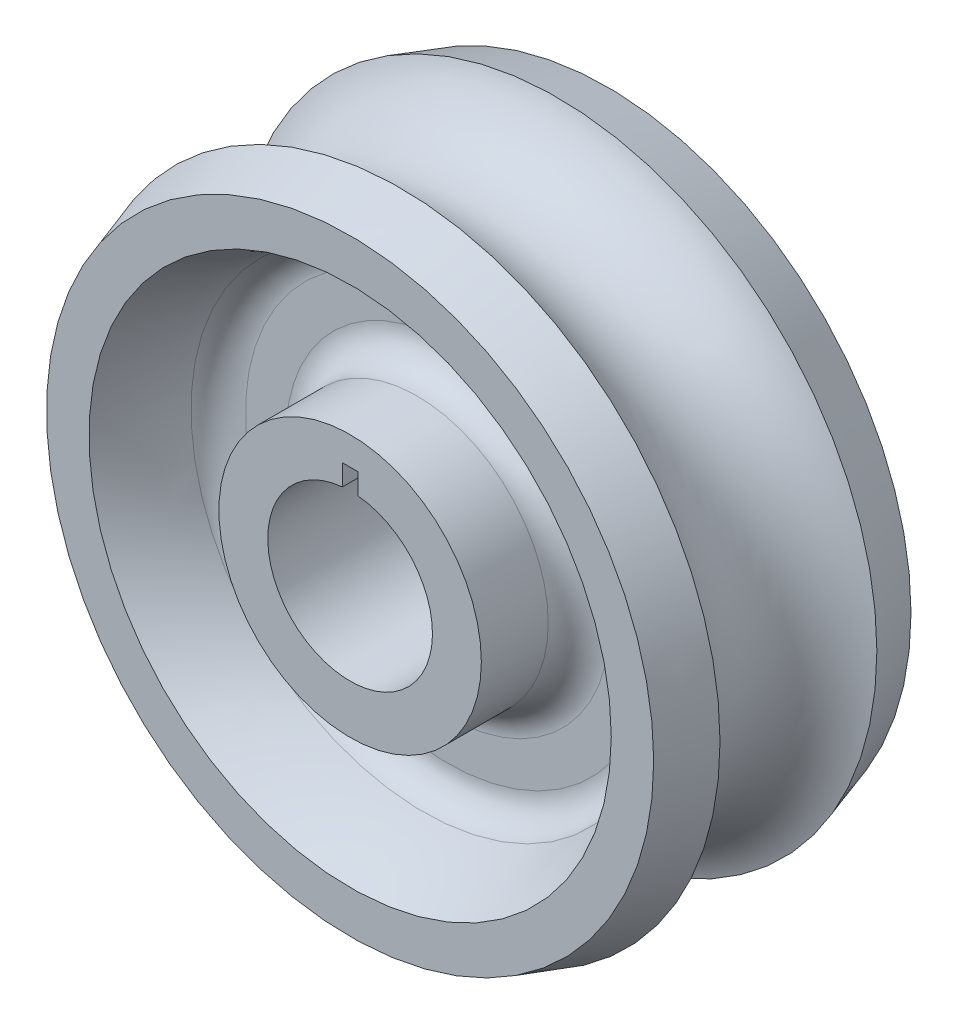
ISO-10303-21;
HEADER;
FILE_DESCRIPTION(('STEP AP214'),'2;1');
FILE_NAME('part.step','',(''),(''),'','','');
FILE_SCHEMA(('AUTOMOTIVE_DESIGN { 1 0 10303 214 1 1 1 1 }'));
ENDSEC;
DATA;
#1=APPLICATION_CONTEXT('core data for automotive mechanical design processes');
#2=APPLICATION_PROTOCOL_DEFINITION('international standard','automotive_design',2000,#1);
#3=PRODUCT_CONTEXT('',#1,'mechanical');
#4=PRODUCT('Part','Part','',(#3));
#5=PRODUCT_RELATED_PRODUCT_CATEGORY('part','',(#4));
#6=PRODUCT_DEFINITION_FORMATION('','',#4);
#7=PRODUCT_DEFINITION_CONTEXT('part definition',#1,'design');
#8=PRODUCT_DEFINITION('design','',#6,#7);
#9=PRODUCT_DEFINITION_SHAPE('','',#8);
#10=(LENGTH_UNIT() NAMED_UNIT(*) SI_UNIT(.MILLI.,.METRE.));
#11=(NAMED_UNIT(*) PLANE_ANGLE_UNIT() SI_UNIT($,.RADIAN.));
#12=(NAMED_UNIT(*) SI_UNIT($,.STERADIAN.) SOLID_ANGLE_UNIT());
#13=UNCERTAINTY_MEASURE_WITH_UNIT(LENGTH_MEASURE(1.E-05),#10,'distance_accuracy_value','');
#14=(GEOMETRIC_REPRESENTATION_CONTEXT(3) GLOBAL_UNCERTAINTY_ASSIGNED_CONTEXT((#13)) GLOBAL_UNIT_ASSIGNED_CONTEXT((#10,
#11,#12)) REPRESENTATION_CONTEXT('',''));
#15=CARTESIAN_POINT('',(0.,0.,0.));
#16=DIRECTION('',(0.,0.,1.));
#17=DIRECTION('',(1.,0.,0.));
#18=AXIS2_PLACEMENT_3D('',#15,#16,#17);
#19=CARTESIAN_POINT('',(0.,8.,-12.5));
#20=DIRECTION('',(0.,0.,1.));
#21=DIRECTION('',(1.,0.,0.));
#22=AXIS2_PLACEMENT_3D('',#19,#20,#21);
#23=PLANE('',#22);
#24=CARTESIAN_POINT('',(0.,0.,-12.5));
#25=DIRECTION('',(0.,0.,1.));
#26=DIRECTION('',(1.,0.,0.));
#27=AXIS2_PLACEMENT_3D('',#24,#25,#26);
#28=CIRCLE('',#27,12.75);
#29=CARTESIAN_POINT('',(12.75,0.,-12.5));
#30=VERTEX_POINT('',#29);
#31=EDGE_CURVE('E111',#30,#30,#28,.T.);
#32=ORIENTED_EDGE('',*,*,#31,.F.);
#33=EDGE_LOOP('',(#32));
#34=FACE_BOUND('',#33,.T.);
#35=DIRECTION('',(0.,1.,0.));
#36=VECTOR('',#35,1.);
#37=CARTESIAN_POINT('',(-0.75,7.964766161037,-12.5));
#38=LINE('',#37,#36);
#39=CARTESIAN_POINT('',(-0.75,7.964766161037,-12.5));
#40=VERTEX_POINT('',#39);
#41=CARTESIAN_POINT('',(-0.75,10.,-12.5));
#42=VERTEX_POINT('',#41);
#43=EDGE_CURVE('E84',#40,#42,#38,.T.);
#44=ORIENTED_EDGE('',*,*,#43,.F.);
#45=CARTESIAN_POINT('',(0.,0.,-12.5));
#46=DIRECTION('',(0.,0.,1.));
#47=DIRECTION('',(1.,0.,0.));
#48=AXIS2_PLACEMENT_3D('',#45,#46,#47);
#49=CIRCLE('',#48,8.);
#50=CARTESIAN_POINT('',(0.75,7.964766161037,-12.5));
#51=VERTEX_POINT('',#50);
#52=EDGE_CURVE('E11',#40,#51,#49,.T.);
#53=ORIENTED_EDGE('',*,*,#52,.T.);
#54=DIRECTION('',(0.,1.,0.));
#55=VECTOR('',#54,1.);
#56=CARTESIAN_POINT('',(0.75,7.964766161037,-12.5));
#57=LINE('',#56,#55);
#58=CARTESIAN_POINT('',(0.75,10.,-12.5));
#59=VERTEX_POINT('',#58);
#60=EDGE_CURVE('E60',#51,#59,#57,.T.);
#61=ORIENTED_EDGE('',*,*,#60,.T.);
#62=DIRECTION('',(1.,0.,0.));
#63=VECTOR('',#62,1.);
#64=CARTESIAN_POINT('',(-0.75,10.,-12.5));
#65=LINE('',#64,#63);
#66=EDGE_CURVE('E91',#42,#59,#65,.T.);
#67=ORIENTED_EDGE('',*,*,#66,.F.);
#68=EDGE_LOOP('',(#44,#53,#61,#67));
#69=FACE_BOUND('',#68,.T.);
#70=ADVANCED_FACE('F39',(#34,#69),#23,.F.);
#71=CARTESIAN_POINT('',(0.,0.,0.));
#72=DIRECTION('',(0.,0.,1.));
#73=DIRECTION('',(1.,0.,0.));
#74=AXIS2_PLACEMENT_3D('',#71,#72,#73);
#75=CYLINDRICAL_SURFACE('',#74,8.);
#76=DIRECTION('',(0.,0.,1.));
#77=VECTOR('',#76,1.);
#78=CARTESIAN_POINT('',(-0.75,7.964766161037,-12.5));
#79=LINE('',#78,#77);
#80=CARTESIAN_POINT('',(-0.75,7.964766161037,12.5));
#81=VERTEX_POINT('',#80);
#82=EDGE_CURVE('E82',#40,#81,#79,.T.);
#83=ORIENTED_EDGE('',*,*,#82,.T.);
#84=CARTESIAN_POINT('',(0.,0.,12.5));
#85=DIRECTION('',(0.,0.,1.));
#86=DIRECTION('',(1.,0.,0.));
#87=AXIS2_PLACEMENT_3D('',#84,#85,#86);
#88=CIRCLE('',#87,8.);
#89=CARTESIAN_POINT('',(0.75,7.964766161037,12.5));
#90=VERTEX_POINT('',#89);
#91=EDGE_CURVE('E47',#81,#90,#88,.T.);
#92=ORIENTED_EDGE('',*,*,#91,.T.);
#93=DIRECTION('',(0.,0.,1.));
#94=VECTOR('',#93,1.);
#95=CARTESIAN_POINT('',(0.75,7.964766161037,-12.5));
#96=LINE('',#95,#94);
#97=EDGE_CURVE('E54',#51,#90,#96,.T.);
#98=ORIENTED_EDGE('',*,*,#97,.F.);
#99=ORIENTED_EDGE('',*,*,#52,.F.);
#100=EDGE_LOOP('',(#83,#92,#98,#99));
#101=FACE_BOUND('',#100,.T.);
#102=ADVANCED_FACE('F163',(#101),#75,.F.);
#103=CARTESIAN_POINT('',(0.,8.,12.5));
#104=DIRECTION('',(0.,0.,1.));
#105=DIRECTION('',(1.,0.,0.));
#106=AXIS2_PLACEMENT_3D('',#103,#104,#105);
#107=PLANE('',#106);
#108=CARTESIAN_POINT('',(0.,0.,12.5));
#109=DIRECTION('',(0.,0.,1.));
#110=DIRECTION('',(1.,0.,0.));
#111=AXIS2_PLACEMENT_3D('',#108,#109,#110);
#112=CIRCLE('',#111,12.75);
#113=CARTESIAN_POINT('',(12.75,0.,12.5));
#114=VERTEX_POINT('',#113);
#115=EDGE_CURVE('E156',#114,#114,#112,.T.);
#116=ORIENTED_EDGE('',*,*,#115,.T.);
#117=EDGE_LOOP('',(#116));
#118=FACE_BOUND('',#117,.T.);
#119=ORIENTED_EDGE('',*,*,#91,.F.);
#120=DIRECTION('',(0.,1.,0.));
#121=VECTOR('',#120,1.);
#122=CARTESIAN_POINT('',(-0.75,7.964766161037,12.5));
#123=LINE('',#122,#121);
#124=CARTESIAN_POINT('',(-0.75,10.,12.5));
#125=VERTEX_POINT('',#124);
#126=EDGE_CURVE('E103',#81,#125,#123,.T.);
#127=ORIENTED_EDGE('',*,*,#126,.T.);
#128=DIRECTION('',(1.,0.,0.));
#129=VECTOR('',#128,1.);
#130=CARTESIAN_POINT('',(-0.75,10.,12.5));
#131=LINE('',#130,#129);
#132=CARTESIAN_POINT('',(0.75,10.,12.5));
#133=VERTEX_POINT('',#132);
#134=EDGE_CURVE('E96',#125,#133,#131,.T.);
#135=ORIENTED_EDGE('',*,*,#134,.T.);
#136=DIRECTION('',(0.,1.,0.));
#137=VECTOR('',#136,1.);
#138=CARTESIAN_POINT('',(0.75,7.964766161037,12.5));
#139=LINE('',#138,#137);
#140=EDGE_CURVE('E92',#90,#133,#139,.T.);
#141=ORIENTED_EDGE('',*,*,#140,.F.);
#142=EDGE_LOOP('',(#119,#127,#135,#141));
#143=FACE_BOUND('',#142,.T.);
#144=ADVANCED_FACE('F165',(#118,#143),#107,.T.);
#145=CARTESIAN_POINT('',(0.,0.,0.));
#146=DIRECTION('',(0.,0.,1.));
#147=DIRECTION('',(1.,0.,0.));
#148=AXIS2_PLACEMENT_3D('',#145,#146,#147);
#149=CYLINDRICAL_SURFACE('',#148,12.75);
#150=CARTESIAN_POINT('',(0.,0.,6.));
#151=DIRECTION('',(0.,0.,1.));
#152=DIRECTION('',(1.,0.,0.));
#153=AXIS2_PLACEMENT_3D('',#150,#151,#152);
#154=CIRCLE('',#153,12.75);
#155=CARTESIAN_POINT('',(12.75,0.,6.));
#156=VERTEX_POINT('',#155);
#157=EDGE_CURVE('E153',#156,#156,#154,.T.);
#158=ORIENTED_EDGE('',*,*,#157,.T.);
#159=EDGE_LOOP('',(#158));
#160=FACE_BOUND('',#159,.T.);
#161=ORIENTED_EDGE('',*,*,#115,.F.);
#162=EDGE_LOOP('',(#161));
#163=FACE_BOUND('',#162,.T.);
#164=ADVANCED_FACE('F241',(#160,#163),#149,.T.);
#165=CARTESIAN_POINT('',(0.,0.,6.));
#166=DIRECTION('',(0.,0.,1.));
#167=DIRECTION('',(1.,0.,0.));
#168=AXIS2_PLACEMENT_3D('',#165,#166,#167);
#169=TOROIDAL_SURFACE('',#168,15.75,3.);
#170=CARTESIAN_POINT('',(0.,0.,3.));
#171=DIRECTION('',(0.,0.,1.));
#172=DIRECTION('',(1.,0.,0.));
#173=AXIS2_PLACEMENT_3D('',#170,#171,#172);
#174=CIRCLE('',#173,15.75);
#175=CARTESIAN_POINT('',(15.75,0.,3.));
#176=VERTEX_POINT('',#175);
#177=EDGE_CURVE('E150',#176,#176,#174,.T.);
#178=ORIENTED_EDGE('',*,*,#177,.T.);
#179=EDGE_LOOP('',(#178));
#180=FACE_BOUND('',#179,.T.);
#181=ORIENTED_EDGE('',*,*,#157,.F.);
#182=EDGE_LOOP('',(#181));
#183=FACE_BOUND('',#182,.T.);
#184=ADVANCED_FACE('F237',(#180,#183),#169,.F.);
#185=CARTESIAN_POINT('',(0.,15.75,3.));
#186=DIRECTION('',(0.,0.,1.));
#187=DIRECTION('',(1.,0.,0.));
#188=AXIS2_PLACEMENT_3D('',#185,#186,#187);
#189=PLANE('',#188);
#190=CARTESIAN_POINT('',(0.,0.,3.));
#191=DIRECTION('',(0.,0.,1.));
#192=DIRECTION('',(1.,0.,0.));
#193=AXIS2_PLACEMENT_3D('',#190,#191,#192);
#194=CIRCLE('',#193,19.6760464322563);
#195=CARTESIAN_POINT('',(19.6760464322563,0.,3.));
#196=VERTEX_POINT('',#195);
#197=EDGE_CURVE('E147',#196,#196,#194,.T.);
#198=ORIENTED_EDGE('',*,*,#197,.T.);
#199=EDGE_LOOP('',(#198));
#200=FACE_BOUND('',#199,.T.);
#201=ORIENTED_EDGE('',*,*,#177,.F.);
#202=EDGE_LOOP('',(#201));
#203=FACE_BOUND('',#202,.T.);
#204=ADVANCED_FACE('F233',(#200,#203),#189,.T.);
#205=CARTESIAN_POINT('',(0.,0.,6.));
#206=DIRECTION('',(0.,0.,1.));
#207=DIRECTION('',(1.,0.,0.));
#208=AXIS2_PLACEMENT_3D('',#205,#206,#207);
#209=TOROIDAL_SURFACE('',#208,19.6760464322563,3.);
#210=CARTESIAN_POINT('',(0.,0.,5.35714285714286));
#211=DIRECTION('',(0.,0.,1.));
#212=DIRECTION('',(1.,0.,0.));
#213=AXIS2_PLACEMENT_3D('',#210,#211,#212);
#214=CIRCLE('',#213,22.6063595032229);
#215=CARTESIAN_POINT('',(22.6063595032229,0.,5.35714285714286));
#216=VERTEX_POINT('',#215);
#217=EDGE_CURVE('E144',#216,#216,#214,.T.);
#218=ORIENTED_EDGE('',*,*,#217,.T.);
#219=EDGE_LOOP('',(#218));
#220=FACE_BOUND('',#219,.T.);
#221=ORIENTED_EDGE('',*,*,#197,.F.);
#222=EDGE_LOOP('',(#221));
#223=FACE_BOUND('',#222,.T.);
#224=ADVANCED_FACE('F229',(#220,#223),#209,.F.);
#225=CARTESIAN_POINT('',(0.,0.,0.));
#226=DIRECTION('',(0.,0.,1.));
#227=DIRECTION('',(1.,0.,0.));
#228=AXIS2_PLACEMENT_3D('',#225,#226,#227);
#229=TOROIDAL_SURFACE('',#228,47.025635094611,25.);
#230=CARTESIAN_POINT('',(0.,0.,12.5));
#231=DIRECTION('',(0.,0.,1.));
#232=DIRECTION('',(1.,0.,0.));
#233=AXIS2_PLACEMENT_3D('',#230,#231,#232);
#234=CIRCLE('',#233,25.375);
#235=CARTESIAN_POINT('',(25.375,0.,12.5));
#236=VERTEX_POINT('',#235);
#237=EDGE_CURVE('E141',#236,#236,#234,.T.);
#238=ORIENTED_EDGE('',*,*,#237,.T.);
#239=EDGE_LOOP('',(#238));
#240=FACE_BOUND('',#239,.T.);
#241=ORIENTED_EDGE('',*,*,#217,.F.);
#242=EDGE_LOOP('',(#241));
#243=FACE_BOUND('',#242,.T.);
#244=ADVANCED_FACE('F225',(#240,#243),#229,.T.);
#245=CARTESIAN_POINT('',(0.,25.375,12.5));
#246=DIRECTION('',(0.,0.,1.));
#247=DIRECTION('',(1.,0.,0.));
#248=AXIS2_PLACEMENT_3D('',#245,#246,#247);
#249=PLANE('',#248);
#250=CARTESIAN_POINT('',(0.,0.,12.5));
#251=DIRECTION('',(0.,0.,1.));
#252=DIRECTION('',(1.,0.,0.));
#253=AXIS2_PLACEMENT_3D('',#250,#251,#252);
#254=CIRCLE('',#253,29.5);
#255=CARTESIAN_POINT('',(29.5,0.,12.5));
#256=VERTEX_POINT('',#255);
#257=EDGE_CURVE('E138',#256,#256,#254,.T.);
#258=ORIENTED_EDGE('',*,*,#257,.T.);
#259=EDGE_LOOP('',(#258));
#260=FACE_BOUND('',#259,.T.);
#261=ORIENTED_EDGE('',*,*,#237,.F.);
#262=EDGE_LOOP('',(#261));
#263=FACE_BOUND('',#262,.T.);
#264=ADVANCED_FACE('F221',(#260,#263),#249,.T.);
#265=CARTESIAN_POINT('',(0.,0.,12.5));
#266=DIRECTION('',(0.,0.,-1.));
#267=DIRECTION('',(-1.,0.,0.));
#268=AXIS2_PLACEMENT_3D('',#265,#266,#267);
#269=CONICAL_SURFACE('',#268,29.5,0.309702944542456);
#270=CARTESIAN_POINT('',(0.,0.,7.61939317759459));
#271=DIRECTION('',(0.,0.,1.));
#272=DIRECTION('',(1.,0.,0.));
#273=AXIS2_PLACEMENT_3D('',#270,#271,#272);
#274=CIRCLE('',#273,31.0617941831697);
#275=CARTESIAN_POINT('',(31.0617941831697,0.,7.61939317759459));
#276=VERTEX_POINT('',#275);
#277=EDGE_CURVE('E135',#276,#276,#274,.T.);
#278=ORIENTED_EDGE('',*,*,#277,.T.);
#279=EDGE_LOOP('',(#278));
#280=FACE_BOUND('',#279,.T.);
#281=ORIENTED_EDGE('',*,*,#257,.F.);
#282=EDGE_LOOP('',(#281));
#283=FACE_BOUND('',#282,.T.);
#284=ADVANCED_FACE('F217',(#280,#283),#269,.T.);
#285=CARTESIAN_POINT('',(0.,0.,0.));
#286=DIRECTION('',(0.,0.,1.));
#287=DIRECTION('',(1.,0.,0.));
#288=AXIS2_PLACEMENT_3D('',#285,#286,#287);
#289=TOROIDAL_SURFACE('',#288,33.5,8.);
#290=ORIENTED_EDGE('',*,*,#277,.F.);
#291=EDGE_LOOP('',(#290));
#292=FACE_BOUND('',#291,.T.);
#293=CARTESIAN_POINT('',(0.,0.,-7.61939317759459));
#294=DIRECTION('',(0.,0.,1.));
#295=DIRECTION('',(1.,0.,0.));
#296=AXIS2_PLACEMENT_3D('',#293,#294,#295);
#297=CIRCLE('',#296,31.0617941831697);
#298=CARTESIAN_POINT('',(31.0617941831697,0.,-7.61939317759459));
#299=VERTEX_POINT('',#298);
#300=EDGE_CURVE('E132',#299,#299,#297,.T.);
#301=ORIENTED_EDGE('',*,*,#300,.T.);
#302=EDGE_LOOP('',(#301));
#303=FACE_BOUND('',#302,.T.);
#304=ADVANCED_FACE('F213',(#292,#303),#289,.F.);
#305=CARTESIAN_POINT('',(0.,0.,-12.5));
#306=DIRECTION('',(0.,0.,1.));
#307=DIRECTION('',(1.,0.,0.));
#308=AXIS2_PLACEMENT_3D('',#305,#306,#307);
#309=CONICAL_SURFACE('',#308,29.5,0.309702944542457);
#310=ORIENTED_EDGE('',*,*,#300,.F.);
#311=EDGE_LOOP('',(#310));
#312=FACE_BOUND('',#311,.T.);
#313=CARTESIAN_POINT('',(0.,0.,-12.5));
#314=DIRECTION('',(0.,0.,1.));
#315=DIRECTION('',(1.,0.,0.));
#316=AXIS2_PLACEMENT_3D('',#313,#314,#315);
#317=CIRCLE('',#316,29.5);
#318=CARTESIAN_POINT('',(29.5,0.,-12.5));
#319=VERTEX_POINT('',#318);
#320=EDGE_CURVE('E129',#319,#319,#317,.T.);
#321=ORIENTED_EDGE('',*,*,#320,.T.);
#322=EDGE_LOOP('',(#321));
#323=FACE_BOUND('',#322,.T.);
#324=ADVANCED_FACE('F209',(#312,#323),#309,.T.);
#325=CARTESIAN_POINT('',(0.,25.375,-12.5));
#326=DIRECTION('',(0.,0.,1.));
#327=DIRECTION('',(1.,0.,0.));
#328=AXIS2_PLACEMENT_3D('',#325,#326,#327);
#329=PLANE('',#328);
#330=ORIENTED_EDGE('',*,*,#320,.F.);
#331=EDGE_LOOP('',(#330));
#332=FACE_BOUND('',#331,.T.);
#333=CARTESIAN_POINT('',(0.,0.,-12.5));
#334=DIRECTION('',(0.,0.,1.));
#335=DIRECTION('',(1.,0.,0.));
#336=AXIS2_PLACEMENT_3D('',#333,#334,#335);
#337=CIRCLE('',#336,25.375);
#338=CARTESIAN_POINT('',(25.375,0.,-12.5));
#339=VERTEX_POINT('',#338);
#340=EDGE_CURVE('E126',#339,#339,#337,.T.);
#341=ORIENTED_EDGE('',*,*,#340,.T.);
#342=EDGE_LOOP('',(#341));
#343=FACE_BOUND('',#342,.T.);
#344=ADVANCED_FACE('F205',(#332,#343),#329,.F.);
#345=CARTESIAN_POINT('',(0.,0.,0.));
#346=DIRECTION('',(0.,0.,1.));
#347=DIRECTION('',(1.,0.,0.));
#348=AXIS2_PLACEMENT_3D('',#345,#346,#347);
#349=TOROIDAL_SURFACE('',#348,47.025635094611,25.);
#350=ORIENTED_EDGE('',*,*,#340,.F.);
#351=EDGE_LOOP('',(#350));
#352=FACE_BOUND('',#351,.T.);
#353=CARTESIAN_POINT('',(0.,0.,-5.35714285714286));
#354=DIRECTION('',(0.,0.,1.));
#355=DIRECTION('',(1.,0.,0.));
#356=AXIS2_PLACEMENT_3D('',#353,#354,#355);
#357=CIRCLE('',#356,22.6063595032229);
#358=CARTESIAN_POINT('',(22.6063595032229,0.,-5.35714285714286));
#359=VERTEX_POINT('',#358);
#360=EDGE_CURVE('E123',#359,#359,#357,.T.);
#361=ORIENTED_EDGE('',*,*,#360,.T.);
#362=EDGE_LOOP('',(#361));
#363=FACE_BOUND('',#362,.T.);
#364=ADVANCED_FACE('F201',(#352,#363),#349,.T.);
#365=CARTESIAN_POINT('',(0.,0.,-6.));
#366=DIRECTION('',(0.,0.,1.));
#367=DIRECTION('',(1.,0.,0.));
#368=AXIS2_PLACEMENT_3D('',#365,#366,#367);
#369=TOROIDAL_SURFACE('',#368,19.6760464322563,3.);
#370=ORIENTED_EDGE('',*,*,#360,.F.);
#371=EDGE_LOOP('',(#370));
#372=FACE_BOUND('',#371,.T.);
#373=CARTESIAN_POINT('',(0.,0.,-3.));
#374=DIRECTION('',(0.,0.,1.));
#375=DIRECTION('',(1.,0.,0.));
#376=AXIS2_PLACEMENT_3D('',#373,#374,#375);
#377=CIRCLE('',#376,19.6760464322563);
#378=CARTESIAN_POINT('',(19.6760464322563,0.,-3.));
#379=VERTEX_POINT('',#378);
#380=EDGE_CURVE('E120',#379,#379,#377,.T.);
#381=ORIENTED_EDGE('',*,*,#380,.T.);
#382=EDGE_LOOP('',(#381));
#383=FACE_BOUND('',#382,.T.);
#384=ADVANCED_FACE('F197',(#372,#383),#369,.F.);
#385=CARTESIAN_POINT('',(0.,15.75,-3.));
#386=DIRECTION('',(0.,0.,1.));
#387=DIRECTION('',(1.,0.,0.));
#388=AXIS2_PLACEMENT_3D('',#385,#386,#387);
#389=PLANE('',#388);
#390=ORIENTED_EDGE('',*,*,#380,.F.);
#391=EDGE_LOOP('',(#390));
#392=FACE_BOUND('',#391,.T.);
#393=CARTESIAN_POINT('',(0.,0.,-3.));
#394=DIRECTION('',(0.,0.,1.));
#395=DIRECTION('',(1.,0.,0.));
#396=AXIS2_PLACEMENT_3D('',#393,#394,#395);
#397=CIRCLE('',#396,15.75);
#398=CARTESIAN_POINT('',(15.75,0.,-3.));
#399=VERTEX_POINT('',#398);
#400=EDGE_CURVE('E117',#399,#399,#397,.T.);
#401=ORIENTED_EDGE('',*,*,#400,.T.);
#402=EDGE_LOOP('',(#401));
#403=FACE_BOUND('',#402,.T.);
#404=ADVANCED_FACE('F190',(#392,#403),#389,.F.);
#405=CARTESIAN_POINT('',(0.,0.,-6.));
#406=DIRECTION('',(0.,0.,1.));
#407=DIRECTION('',(1.,0.,0.));
#408=AXIS2_PLACEMENT_3D('',#405,#406,#407);
#409=TOROIDAL_SURFACE('',#408,15.75,3.);
#410=ORIENTED_EDGE('',*,*,#400,.F.);
#411=EDGE_LOOP('',(#410));
#412=FACE_BOUND('',#411,.T.);
#413=CARTESIAN_POINT('',(0.,0.,-6.));
#414=DIRECTION('',(0.,0.,1.));
#415=DIRECTION('',(1.,0.,0.));
#416=AXIS2_PLACEMENT_3D('',#413,#414,#415);
#417=CIRCLE('',#416,12.75);
#418=CARTESIAN_POINT('',(12.75,0.,-6.));
#419=VERTEX_POINT('',#418);
#420=EDGE_CURVE('E114',#419,#419,#417,.T.);
#421=ORIENTED_EDGE('',*,*,#420,.T.);
#422=EDGE_LOOP('',(#421));
#423=FACE_BOUND('',#422,.T.);
#424=ADVANCED_FACE('F182',(#412,#423),#409,.F.);
#425=CARTESIAN_POINT('',(0.,0.,0.));
#426=DIRECTION('',(0.,0.,1.));
#427=DIRECTION('',(1.,0.,0.));
#428=AXIS2_PLACEMENT_3D('',#425,#426,#427);
#429=CYLINDRICAL_SURFACE('',#428,12.75);
#430=ORIENTED_EDGE('',*,*,#420,.F.);
#431=EDGE_LOOP('',(#430));
#432=FACE_BOUND('',#431,.T.);
#433=ORIENTED_EDGE('',*,*,#31,.T.);
#434=EDGE_LOOP('',(#433));
#435=FACE_BOUND('',#434,.T.);
#436=ADVANCED_FACE('F180',(#432,#435),#429,.T.);
#437=CARTESIAN_POINT('',(-0.75,7.964766161037,-12.5));
#438=DIRECTION('',(1.,0.,0.));
#439=DIRECTION('',(0.,0.,-1.));
#440=AXIS2_PLACEMENT_3D('',#437,#438,#439);
#441=PLANE('',#440);
#442=ORIENTED_EDGE('',*,*,#126,.F.);
#443=ORIENTED_EDGE('',*,*,#82,.F.);
#444=ORIENTED_EDGE('',*,*,#43,.T.);
#445=DIRECTION('',(0.,0.,1.));
#446=VECTOR('',#445,1.);
#447=CARTESIAN_POINT('',(-0.75,10.,-12.5));
#448=LINE('',#447,#446);
#449=EDGE_CURVE('E87',#42,#125,#448,.T.);
#450=ORIENTED_EDGE('',*,*,#449,.T.);
#451=EDGE_LOOP('',(#442,#443,#444,#450));
#452=FACE_BOUND('',#451,.T.);
#453=ADVANCED_FACE('F86',(#452),#441,.T.);
#454=CARTESIAN_POINT('',(-0.75,10.,-12.5));
#455=DIRECTION('',(0.,-1.,0.));
#456=DIRECTION('',(0.,0.,-1.));
#457=AXIS2_PLACEMENT_3D('',#454,#455,#456);
#458=PLANE('',#457);
#459=ORIENTED_EDGE('',*,*,#134,.F.);
#460=ORIENTED_EDGE('',*,*,#449,.F.);
#461=ORIENTED_EDGE('',*,*,#66,.T.);
#462=DIRECTION('',(0.,0.,1.));
#463=VECTOR('',#462,1.);
#464=CARTESIAN_POINT('',(0.75,10.,-12.5));
#465=LINE('',#464,#463);
#466=EDGE_CURVE('E76',#59,#133,#465,.T.);
#467=ORIENTED_EDGE('',*,*,#466,.T.);
#468=EDGE_LOOP('',(#459,#460,#461,#467));
#469=FACE_BOUND('',#468,.T.);
#470=ADVANCED_FACE('F94',(#469),#458,.T.);
#471=CARTESIAN_POINT('',(0.75,7.964766161037,-12.5));
#472=DIRECTION('',(1.,0.,0.));
#473=DIRECTION('',(0.,0.,-1.));
#474=AXIS2_PLACEMENT_3D('',#471,#472,#473);
#475=PLANE('',#474);
#476=ORIENTED_EDGE('',*,*,#140,.T.);
#477=ORIENTED_EDGE('',*,*,#466,.F.);
#478=ORIENTED_EDGE('',*,*,#60,.F.);
#479=ORIENTED_EDGE('',*,*,#97,.T.);
#480=EDGE_LOOP('',(#476,#477,#478,#479));
#481=FACE_BOUND('',#480,.T.);
#482=ADVANCED_FACE('F166',(#481),#475,.F.);
#483=CLOSED_SHELL('',(#70,#102,#144,#164,#184,#204,#224,#244,#264,#284,#304,#324,#344,#364,#384,
#404,#424,#436,#453,#470,#482));
#484=MANIFOLD_SOLID_BREP('B2',#483);
#485=ADVANCED_BREP_SHAPE_REPRESENTATION('',(#18,#484),#14);
#486=SHAPE_DEFINITION_REPRESENTATION(#9,#485);
ENDSEC;
END-ISO-10303-21;
